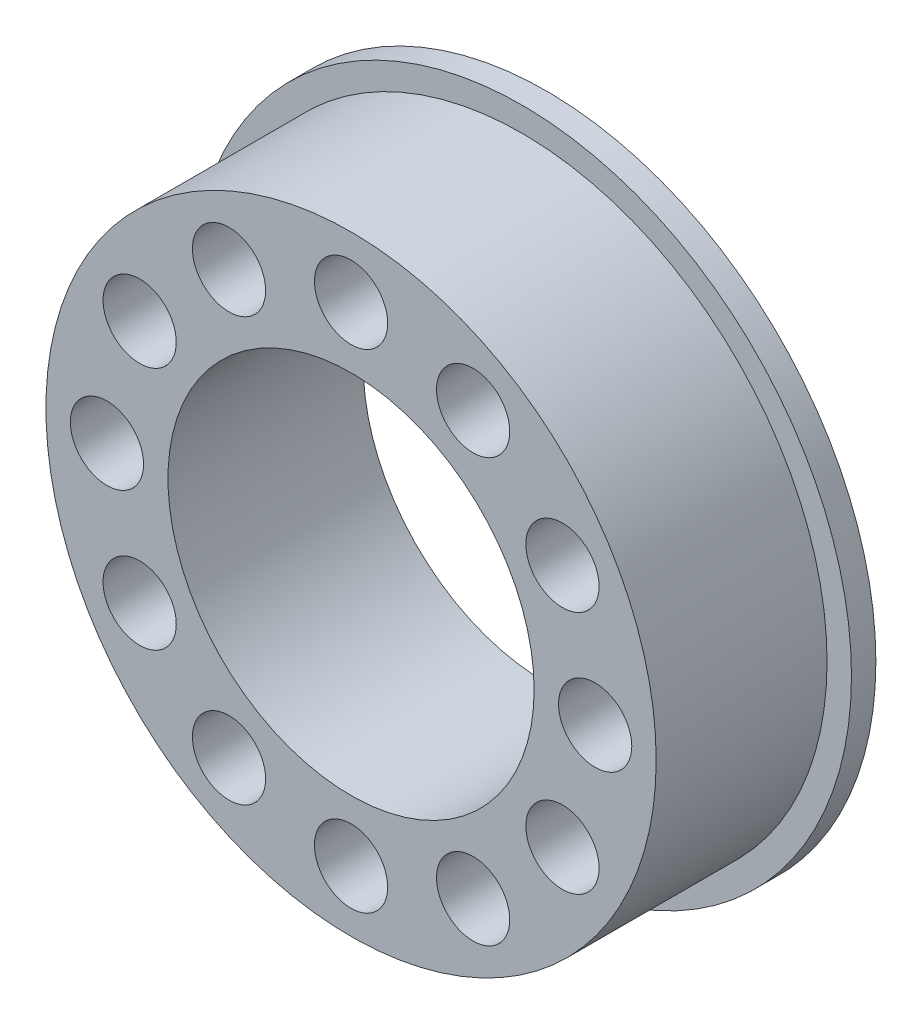
ISO-10303-21;
HEADER;
FILE_DESCRIPTION(('STEP AP214'),'2;1');
FILE_NAME('part.step','',(''),(''),'','','');
FILE_SCHEMA(('AUTOMOTIVE_DESIGN { 1 0 10303 214 1 1 1 1 }'));
ENDSEC;
DATA;
#1=APPLICATION_CONTEXT('core data for automotive mechanical design processes');
#2=APPLICATION_PROTOCOL_DEFINITION('international standard','automotive_design',2000,#1);
#3=PRODUCT_CONTEXT('',#1,'mechanical');
#4=PRODUCT('Part','Part','',(#3));
#5=PRODUCT_RELATED_PRODUCT_CATEGORY('part','',(#4));
#6=PRODUCT_DEFINITION_FORMATION('','',#4);
#7=PRODUCT_DEFINITION_CONTEXT('part definition',#1,'design');
#8=PRODUCT_DEFINITION('design','',#6,#7);
#9=PRODUCT_DEFINITION_SHAPE('','',#8);
#10=(LENGTH_UNIT() NAMED_UNIT(*) SI_UNIT(.MILLI.,.METRE.));
#11=(NAMED_UNIT(*) PLANE_ANGLE_UNIT() SI_UNIT($,.RADIAN.));
#12=(NAMED_UNIT(*) SI_UNIT($,.STERADIAN.) SOLID_ANGLE_UNIT());
#13=UNCERTAINTY_MEASURE_WITH_UNIT(LENGTH_MEASURE(1.E-05),#10,'distance_accuracy_value','');
#14=(GEOMETRIC_REPRESENTATION_CONTEXT(3) GLOBAL_UNCERTAINTY_ASSIGNED_CONTEXT((#13)) GLOBAL_UNIT_ASSIGNED_CONTEXT((#10,
#11,#12)) REPRESENTATION_CONTEXT('',''));
#15=CARTESIAN_POINT('',(0.,0.,0.));
#16=DIRECTION('',(0.,0.,1.));
#17=DIRECTION('',(1.,0.,0.));
#18=AXIS2_PLACEMENT_3D('',#15,#16,#17);
#19=CARTESIAN_POINT('',(0.,12.5,0.));
#20=DIRECTION('',(0.,0.,-1.));
#21=DIRECTION('',(-1.,0.,0.));
#22=AXIS2_PLACEMENT_3D('',#19,#20,#21);
#23=PLANE('',#22);
#24=CARTESIAN_POINT('',(5.00000000000001,8.66025403784438,0.));
#25=DIRECTION('',(0.,0.,1.));
#26=DIRECTION('',(1.,0.,0.));
#27=AXIS2_PLACEMENT_3D('',#24,#25,#26);
#28=CIRCLE('',#27,1.5);
#29=CARTESIAN_POINT('',(6.50000000000001,8.66025403784438,0.));
#30=VERTEX_POINT('',#29);
#31=EDGE_CURVE('E130',#30,#30,#28,.T.);
#32=ORIENTED_EDGE('',*,*,#31,.F.);
#33=EDGE_LOOP('',(#32));
#34=FACE_BOUND('',#33,.T.);
#35=CARTESIAN_POINT('',(8.66025403784439,5.,0.));
#36=DIRECTION('',(0.,0.,1.));
#37=DIRECTION('',(1.,0.,0.));
#38=AXIS2_PLACEMENT_3D('',#35,#36,#37);
#39=CIRCLE('',#38,1.50000000000031);
#40=CARTESIAN_POINT('',(10.1602540378447,5.,0.));
#41=VERTEX_POINT('',#40);
#42=EDGE_CURVE('E124',#41,#41,#39,.T.);
#43=ORIENTED_EDGE('',*,*,#42,.F.);
#44=EDGE_LOOP('',(#43));
#45=FACE_BOUND('',#44,.T.);
#46=CARTESIAN_POINT('',(10.,0.,0.));
#47=DIRECTION('',(0.,0.,1.));
#48=DIRECTION('',(1.,0.,0.));
#49=AXIS2_PLACEMENT_3D('',#46,#47,#48);
#50=CIRCLE('',#49,1.50000000000053);
#51=CARTESIAN_POINT('',(11.5000000000005,0.,0.));
#52=VERTEX_POINT('',#51);
#53=EDGE_CURVE('E118',#52,#52,#50,.T.);
#54=ORIENTED_EDGE('',*,*,#53,.F.);
#55=EDGE_LOOP('',(#54));
#56=FACE_BOUND('',#55,.T.);
#57=CARTESIAN_POINT('',(8.66025403784439,-5.,0.));
#58=DIRECTION('',(0.,0.,1.));
#59=DIRECTION('',(1.,0.,0.));
#60=AXIS2_PLACEMENT_3D('',#57,#58,#59);
#61=CIRCLE('',#60,1.50000000000072);
#62=CARTESIAN_POINT('',(10.1602540378451,-5.,0.));
#63=VERTEX_POINT('',#62);
#64=EDGE_CURVE('E112',#63,#63,#61,.T.);
#65=ORIENTED_EDGE('',*,*,#64,.F.);
#66=EDGE_LOOP('',(#65));
#67=FACE_BOUND('',#66,.T.);
#68=CARTESIAN_POINT('',(5.,-8.66025403784439,0.));
#69=DIRECTION('',(0.,0.,1.));
#70=DIRECTION('',(1.,0.,0.));
#71=AXIS2_PLACEMENT_3D('',#68,#69,#70);
#72=CIRCLE('',#71,1.50000000000082);
#73=CARTESIAN_POINT('',(6.50000000000082,-8.66025403784439,0.));
#74=VERTEX_POINT('',#73);
#75=EDGE_CURVE('E106',#74,#74,#72,.T.);
#76=ORIENTED_EDGE('',*,*,#75,.F.);
#77=EDGE_LOOP('',(#76));
#78=FACE_BOUND('',#77,.T.);
#79=CARTESIAN_POINT('',(0.,-10.,0.));
#80=DIRECTION('',(0.,0.,1.));
#81=DIRECTION('',(1.,0.,0.));
#82=AXIS2_PLACEMENT_3D('',#79,#80,#81);
#83=CIRCLE('',#82,1.50000000000081);
#84=CARTESIAN_POINT('',(1.50000000000081,-10.,0.));
#85=VERTEX_POINT('',#84);
#86=EDGE_CURVE('E100',#85,#85,#83,.T.);
#87=ORIENTED_EDGE('',*,*,#86,.F.);
#88=EDGE_LOOP('',(#87));
#89=FACE_BOUND('',#88,.T.);
#90=CARTESIAN_POINT('',(-5.,-8.66025403784439,0.));
#91=DIRECTION('',(0.,0.,1.));
#92=DIRECTION('',(1.,0.,0.));
#93=AXIS2_PLACEMENT_3D('',#90,#91,#92);
#94=CIRCLE('',#93,1.5000000000007);
#95=CARTESIAN_POINT('',(-3.4999999999993,-8.66025403784439,0.));
#96=VERTEX_POINT('',#95);
#97=EDGE_CURVE('E94',#96,#96,#94,.T.);
#98=ORIENTED_EDGE('',*,*,#97,.F.);
#99=EDGE_LOOP('',(#98));
#100=FACE_BOUND('',#99,.T.);
#101=CARTESIAN_POINT('',(-8.66025403784439,-5.,0.));
#102=DIRECTION('',(0.,0.,1.));
#103=DIRECTION('',(1.,0.,0.));
#104=AXIS2_PLACEMENT_3D('',#101,#102,#103);
#105=CIRCLE('',#104,1.5000000000005);
#106=CARTESIAN_POINT('',(-7.16025403784388,-5.,0.));
#107=VERTEX_POINT('',#106);
#108=EDGE_CURVE('E88',#107,#107,#105,.T.);
#109=ORIENTED_EDGE('',*,*,#108,.F.);
#110=EDGE_LOOP('',(#109));
#111=FACE_BOUND('',#110,.T.);
#112=CARTESIAN_POINT('',(-10.,0.,0.));
#113=DIRECTION('',(0.,0.,1.));
#114=DIRECTION('',(1.,0.,0.));
#115=AXIS2_PLACEMENT_3D('',#112,#113,#114);
#116=CIRCLE('',#115,1.50000000000028);
#117=CARTESIAN_POINT('',(-8.49999999999972,0.,0.));
#118=VERTEX_POINT('',#117);
#119=EDGE_CURVE('E82',#118,#118,#116,.T.);
#120=ORIENTED_EDGE('',*,*,#119,.F.);
#121=EDGE_LOOP('',(#120));
#122=FACE_BOUND('',#121,.T.);
#123=CARTESIAN_POINT('',(-8.66025403784439,4.99999999999999,0.));
#124=DIRECTION('',(0.,0.,1.));
#125=DIRECTION('',(1.,0.,0.));
#126=AXIS2_PLACEMENT_3D('',#123,#124,#125);
#127=CIRCLE('',#126,1.5000000000001);
#128=CARTESIAN_POINT('',(-7.16025403784429,4.99999999999999,0.));
#129=VERTEX_POINT('',#128);
#130=EDGE_CURVE('E76',#129,#129,#127,.T.);
#131=ORIENTED_EDGE('',*,*,#130,.F.);
#132=EDGE_LOOP('',(#131));
#133=FACE_BOUND('',#132,.T.);
#134=CARTESIAN_POINT('',(-4.99999999999995,8.66025403784417,0.));
#135=DIRECTION('',(0.,0.,1.));
#136=DIRECTION('',(1.,0.,0.));
#137=AXIS2_PLACEMENT_3D('',#134,#135,#136);
#138=CIRCLE('',#137,1.5);
#139=CARTESIAN_POINT('',(-3.49999999999995,8.66025403784417,0.));
#140=VERTEX_POINT('',#139);
#141=EDGE_CURVE('E70',#140,#140,#138,.T.);
#142=ORIENTED_EDGE('',*,*,#141,.F.);
#143=EDGE_LOOP('',(#142));
#144=FACE_BOUND('',#143,.T.);
#145=CARTESIAN_POINT('',(0.,10.,0.));
#146=DIRECTION('',(0.,0.,1.));
#147=DIRECTION('',(1.,0.,0.));
#148=AXIS2_PLACEMENT_3D('',#145,#146,#147);
#149=CIRCLE('',#148,1.5);
#150=CARTESIAN_POINT('',(1.5,10.,0.));
#151=VERTEX_POINT('',#150);
#152=EDGE_CURVE('E64',#151,#151,#149,.T.);
#153=ORIENTED_EDGE('',*,*,#152,.F.);
#154=EDGE_LOOP('',(#153));
#155=FACE_BOUND('',#154,.T.);
#156=CARTESIAN_POINT('',(0.,0.,0.));
#157=DIRECTION('',(0.,0.,1.));
#158=DIRECTION('',(1.,0.,0.));
#159=AXIS2_PLACEMENT_3D('',#156,#157,#158);
#160=CIRCLE('',#159,7.5);
#161=CARTESIAN_POINT('',(7.5,0.,0.));
#162=VERTEX_POINT('',#161);
#163=EDGE_CURVE('E10',#162,#162,#160,.T.);
#164=ORIENTED_EDGE('',*,*,#163,.F.);
#165=EDGE_LOOP('',(#164));
#166=FACE_BOUND('',#165,.T.);
#167=CARTESIAN_POINT('',(0.,0.,0.));
#168=DIRECTION('',(0.,0.,1.));
#169=DIRECTION('',(1.,0.,0.));
#170=AXIS2_PLACEMENT_3D('',#167,#168,#169);
#171=CIRCLE('',#170,12.5);
#172=CARTESIAN_POINT('',(12.5,0.,0.));
#173=VERTEX_POINT('',#172);
#174=EDGE_CURVE('E60',#173,#173,#171,.T.);
#175=ORIENTED_EDGE('',*,*,#174,.T.);
#176=EDGE_LOOP('',(#175));
#177=FACE_BOUND('',#176,.T.);
#178=ADVANCED_FACE('F38',(#34,#45,#56,#67,#78,#89,#100,#111,#122,#133,#144,#155,#166,#177),#23,.F.);
#179=CARTESIAN_POINT('',(0.,0.,0.));
#180=DIRECTION('',(0.,0.,1.));
#181=DIRECTION('',(1.,0.,0.));
#182=AXIS2_PLACEMENT_3D('',#179,#180,#181);
#183=CYLINDRICAL_SURFACE('',#182,7.5);
#184=CARTESIAN_POINT('',(0.,0.,-8.));
#185=DIRECTION('',(0.,0.,1.));
#186=DIRECTION('',(1.,0.,0.));
#187=AXIS2_PLACEMENT_3D('',#184,#185,#186);
#188=CIRCLE('',#187,7.5);
#189=CARTESIAN_POINT('',(7.5,0.,-8.));
#190=VERTEX_POINT('',#189);
#191=EDGE_CURVE('E44',#190,#190,#188,.T.);
#192=ORIENTED_EDGE('',*,*,#191,.F.);
#193=EDGE_LOOP('',(#192));
#194=FACE_BOUND('',#193,.T.);
#195=ORIENTED_EDGE('',*,*,#163,.T.);
#196=EDGE_LOOP('',(#195));
#197=FACE_BOUND('',#196,.T.);
#198=ADVANCED_FACE('F148',(#194,#197),#183,.F.);
#199=CARTESIAN_POINT('',(0.,7.5,-8.));
#200=DIRECTION('',(0.,0.,1.));
#201=DIRECTION('',(1.,0.,0.));
#202=AXIS2_PLACEMENT_3D('',#199,#200,#201);
#203=PLANE('',#202);
#204=CARTESIAN_POINT('',(5.00000000000001,8.66025403784438,-8.));
#205=DIRECTION('',(0.,0.,1.));
#206=DIRECTION('',(1.,0.,0.));
#207=AXIS2_PLACEMENT_3D('',#204,#205,#206);
#208=CIRCLE('',#207,1.5);
#209=CARTESIAN_POINT('',(6.50000000000001,8.66025403784438,-8.));
#210=VERTEX_POINT('',#209);
#211=EDGE_CURVE('E67',#210,#210,#208,.T.);
#212=ORIENTED_EDGE('',*,*,#211,.T.);
#213=EDGE_LOOP('',(#212));
#214=FACE_BOUND('',#213,.T.);
#215=CARTESIAN_POINT('',(8.66025403784439,5.,-8.));
#216=DIRECTION('',(0.,0.,1.));
#217=DIRECTION('',(1.,0.,0.));
#218=AXIS2_PLACEMENT_3D('',#215,#216,#217);
#219=CIRCLE('',#218,1.50000000000031);
#220=CARTESIAN_POINT('',(10.1602540378447,5.,-8.));
#221=VERTEX_POINT('',#220);
#222=EDGE_CURVE('E127',#221,#221,#219,.T.);
#223=ORIENTED_EDGE('',*,*,#222,.T.);
#224=EDGE_LOOP('',(#223));
#225=FACE_BOUND('',#224,.T.);
#226=CARTESIAN_POINT('',(10.,0.,-8.));
#227=DIRECTION('',(0.,0.,1.));
#228=DIRECTION('',(1.,0.,0.));
#229=AXIS2_PLACEMENT_3D('',#226,#227,#228);
#230=CIRCLE('',#229,1.50000000000053);
#231=CARTESIAN_POINT('',(11.5000000000005,0.,-8.));
#232=VERTEX_POINT('',#231);
#233=EDGE_CURVE('E121',#232,#232,#230,.T.);
#234=ORIENTED_EDGE('',*,*,#233,.T.);
#235=EDGE_LOOP('',(#234));
#236=FACE_BOUND('',#235,.T.);
#237=CARTESIAN_POINT('',(8.66025403784439,-5.,-8.));
#238=DIRECTION('',(0.,0.,1.));
#239=DIRECTION('',(1.,0.,0.));
#240=AXIS2_PLACEMENT_3D('',#237,#238,#239);
#241=CIRCLE('',#240,1.50000000000072);
#242=CARTESIAN_POINT('',(10.1602540378451,-5.,-8.));
#243=VERTEX_POINT('',#242);
#244=EDGE_CURVE('E115',#243,#243,#241,.T.);
#245=ORIENTED_EDGE('',*,*,#244,.T.);
#246=EDGE_LOOP('',(#245));
#247=FACE_BOUND('',#246,.T.);
#248=CARTESIAN_POINT('',(5.,-8.66025403784439,-8.));
#249=DIRECTION('',(0.,0.,1.));
#250=DIRECTION('',(1.,0.,0.));
#251=AXIS2_PLACEMENT_3D('',#248,#249,#250);
#252=CIRCLE('',#251,1.50000000000082);
#253=CARTESIAN_POINT('',(6.50000000000082,-8.66025403784439,-8.));
#254=VERTEX_POINT('',#253);
#255=EDGE_CURVE('E109',#254,#254,#252,.T.);
#256=ORIENTED_EDGE('',*,*,#255,.T.);
#257=EDGE_LOOP('',(#256));
#258=FACE_BOUND('',#257,.T.);
#259=CARTESIAN_POINT('',(0.,-10.,-8.));
#260=DIRECTION('',(0.,0.,1.));
#261=DIRECTION('',(1.,0.,0.));
#262=AXIS2_PLACEMENT_3D('',#259,#260,#261);
#263=CIRCLE('',#262,1.50000000000081);
#264=CARTESIAN_POINT('',(1.50000000000081,-10.,-8.));
#265=VERTEX_POINT('',#264);
#266=EDGE_CURVE('E103',#265,#265,#263,.T.);
#267=ORIENTED_EDGE('',*,*,#266,.T.);
#268=EDGE_LOOP('',(#267));
#269=FACE_BOUND('',#268,.T.);
#270=CARTESIAN_POINT('',(-5.,-8.66025403784439,-8.));
#271=DIRECTION('',(0.,0.,1.));
#272=DIRECTION('',(1.,0.,0.));
#273=AXIS2_PLACEMENT_3D('',#270,#271,#272);
#274=CIRCLE('',#273,1.5000000000007);
#275=CARTESIAN_POINT('',(-3.4999999999993,-8.66025403784439,-8.));
#276=VERTEX_POINT('',#275);
#277=EDGE_CURVE('E97',#276,#276,#274,.T.);
#278=ORIENTED_EDGE('',*,*,#277,.T.);
#279=EDGE_LOOP('',(#278));
#280=FACE_BOUND('',#279,.T.);
#281=CARTESIAN_POINT('',(-8.66025403784439,-5.,-8.));
#282=DIRECTION('',(0.,0.,1.));
#283=DIRECTION('',(1.,0.,0.));
#284=AXIS2_PLACEMENT_3D('',#281,#282,#283);
#285=CIRCLE('',#284,1.5000000000005);
#286=CARTESIAN_POINT('',(-7.16025403784388,-5.,-8.));
#287=VERTEX_POINT('',#286);
#288=EDGE_CURVE('E91',#287,#287,#285,.T.);
#289=ORIENTED_EDGE('',*,*,#288,.T.);
#290=EDGE_LOOP('',(#289));
#291=FACE_BOUND('',#290,.T.);
#292=CARTESIAN_POINT('',(-10.,0.,-8.));
#293=DIRECTION('',(0.,0.,1.));
#294=DIRECTION('',(1.,0.,0.));
#295=AXIS2_PLACEMENT_3D('',#292,#293,#294);
#296=CIRCLE('',#295,1.50000000000028);
#297=CARTESIAN_POINT('',(-8.49999999999972,0.,-8.));
#298=VERTEX_POINT('',#297);
#299=EDGE_CURVE('E85',#298,#298,#296,.T.);
#300=ORIENTED_EDGE('',*,*,#299,.T.);
#301=EDGE_LOOP('',(#300));
#302=FACE_BOUND('',#301,.T.);
#303=CARTESIAN_POINT('',(-8.66025403784439,4.99999999999999,-8.));
#304=DIRECTION('',(0.,0.,1.));
#305=DIRECTION('',(1.,0.,0.));
#306=AXIS2_PLACEMENT_3D('',#303,#304,#305);
#307=CIRCLE('',#306,1.5000000000001);
#308=CARTESIAN_POINT('',(-7.16025403784429,4.99999999999999,-8.));
#309=VERTEX_POINT('',#308);
#310=EDGE_CURVE('E79',#309,#309,#307,.T.);
#311=ORIENTED_EDGE('',*,*,#310,.T.);
#312=EDGE_LOOP('',(#311));
#313=FACE_BOUND('',#312,.T.);
#314=CARTESIAN_POINT('',(-4.99999999999995,8.66025403784417,-8.));
#315=DIRECTION('',(0.,0.,1.));
#316=DIRECTION('',(1.,0.,0.));
#317=AXIS2_PLACEMENT_3D('',#314,#315,#316);
#318=CIRCLE('',#317,1.5);
#319=CARTESIAN_POINT('',(-3.49999999999995,8.66025403784417,-8.));
#320=VERTEX_POINT('',#319);
#321=EDGE_CURVE('E73',#320,#320,#318,.T.);
#322=ORIENTED_EDGE('',*,*,#321,.T.);
#323=EDGE_LOOP('',(#322));
#324=FACE_BOUND('',#323,.T.);
#325=CARTESIAN_POINT('',(0.,10.,-8.));
#326=DIRECTION('',(0.,0.,1.));
#327=DIRECTION('',(1.,0.,0.));
#328=AXIS2_PLACEMENT_3D('',#325,#326,#327);
#329=CIRCLE('',#328,1.5);
#330=CARTESIAN_POINT('',(1.5,10.,-8.));
#331=VERTEX_POINT('',#330);
#332=EDGE_CURVE('E63',#331,#331,#329,.T.);
#333=ORIENTED_EDGE('',*,*,#332,.T.);
#334=EDGE_LOOP('',(#333));
#335=FACE_BOUND('',#334,.T.);
#336=CARTESIAN_POINT('',(0.,0.,-8.));
#337=DIRECTION('',(0.,0.,1.));
#338=DIRECTION('',(1.,0.,0.));
#339=AXIS2_PLACEMENT_3D('',#336,#337,#338);
#340=CIRCLE('',#339,13.5);
#341=CARTESIAN_POINT('',(13.5,0.,-8.));
#342=VERTEX_POINT('',#341);
#343=EDGE_CURVE('E48',#342,#342,#340,.T.);
#344=ORIENTED_EDGE('',*,*,#343,.F.);
#345=EDGE_LOOP('',(#344));
#346=FACE_BOUND('',#345,.T.);
#347=ORIENTED_EDGE('',*,*,#191,.T.);
#348=EDGE_LOOP('',(#347));
#349=FACE_BOUND('',#348,.T.);
#350=ADVANCED_FACE('F136',(#214,#225,#236,#247,#258,#269,#280,#291,#302,#313,#324,#335,#346,
#349),#203,.F.);
#351=CARTESIAN_POINT('',(0.,0.,0.));
#352=DIRECTION('',(0.,0.,1.));
#353=DIRECTION('',(1.,0.,0.));
#354=AXIS2_PLACEMENT_3D('',#351,#352,#353);
#355=CYLINDRICAL_SURFACE('',#354,13.5);
#356=CARTESIAN_POINT('',(0.,0.,-7.));
#357=DIRECTION('',(0.,0.,1.));
#358=DIRECTION('',(1.,0.,0.));
#359=AXIS2_PLACEMENT_3D('',#356,#357,#358);
#360=CIRCLE('',#359,13.5);
#361=CARTESIAN_POINT('',(13.5,0.,-7.));
#362=VERTEX_POINT('',#361);
#363=EDGE_CURVE('E52',#362,#362,#360,.T.);
#364=ORIENTED_EDGE('',*,*,#363,.F.);
#365=EDGE_LOOP('',(#364));
#366=FACE_BOUND('',#365,.T.);
#367=ORIENTED_EDGE('',*,*,#343,.T.);
#368=EDGE_LOOP('',(#367));
#369=FACE_BOUND('',#368,.T.);
#370=ADVANCED_FACE('F184',(#366,#369),#355,.T.);
#371=CARTESIAN_POINT('',(0.,13.5,-7.));
#372=DIRECTION('',(0.,0.,-1.));
#373=DIRECTION('',(-1.,0.,0.));
#374=AXIS2_PLACEMENT_3D('',#371,#372,#373);
#375=PLANE('',#374);
#376=CARTESIAN_POINT('',(0.,0.,-7.));
#377=DIRECTION('',(0.,0.,1.));
#378=DIRECTION('',(1.,0.,0.));
#379=AXIS2_PLACEMENT_3D('',#376,#377,#378);
#380=CIRCLE('',#379,12.5);
#381=CARTESIAN_POINT('',(12.5,0.,-7.));
#382=VERTEX_POINT('',#381);
#383=EDGE_CURVE('E57',#382,#382,#380,.T.);
#384=ORIENTED_EDGE('',*,*,#383,.F.);
#385=EDGE_LOOP('',(#384));
#386=FACE_BOUND('',#385,.T.);
#387=ORIENTED_EDGE('',*,*,#363,.T.);
#388=EDGE_LOOP('',(#387));
#389=FACE_BOUND('',#388,.T.);
#390=ADVANCED_FACE('F178',(#386,#389),#375,.F.);
#391=CARTESIAN_POINT('',(0.,0.,0.));
#392=DIRECTION('',(0.,0.,1.));
#393=DIRECTION('',(1.,0.,0.));
#394=AXIS2_PLACEMENT_3D('',#391,#392,#393);
#395=CYLINDRICAL_SURFACE('',#394,12.5);
#396=ORIENTED_EDGE('',*,*,#174,.F.);
#397=EDGE_LOOP('',(#396));
#398=FACE_BOUND('',#397,.T.);
#399=ORIENTED_EDGE('',*,*,#383,.T.);
#400=EDGE_LOOP('',(#399));
#401=FACE_BOUND('',#400,.T.);
#402=ADVANCED_FACE('F174',(#398,#401),#395,.T.);
#403=CARTESIAN_POINT('',(0.,10.,-8.));
#404=DIRECTION('',(0.,0.,1.));
#405=DIRECTION('',(1.,0.,0.));
#406=AXIS2_PLACEMENT_3D('',#403,#404,#405);
#407=CYLINDRICAL_SURFACE('',#406,1.5);
#408=ORIENTED_EDGE('',*,*,#332,.F.);
#409=EDGE_LOOP('',(#408));
#410=FACE_BOUND('',#409,.T.);
#411=ORIENTED_EDGE('',*,*,#152,.T.);
#412=EDGE_LOOP('',(#411));
#413=FACE_BOUND('',#412,.T.);
#414=ADVANCED_FACE('F177',(#410,#413),#407,.F.);
#415=CARTESIAN_POINT('',(-4.99999999999995,8.66025403784417,-8.));
#416=DIRECTION('',(0.,0.,1.));
#417=DIRECTION('',(1.,0.,0.));
#418=AXIS2_PLACEMENT_3D('',#415,#416,#417);
#419=CYLINDRICAL_SURFACE('',#418,1.5);
#420=ORIENTED_EDGE('',*,*,#321,.F.);
#421=EDGE_LOOP('',(#420));
#422=FACE_BOUND('',#421,.T.);
#423=ORIENTED_EDGE('',*,*,#141,.T.);
#424=EDGE_LOOP('',(#423));
#425=FACE_BOUND('',#424,.T.);
#426=ADVANCED_FACE('F203',(#422,#425),#419,.F.);
#427=CARTESIAN_POINT('',(-8.66025403784439,4.99999999999999,-8.));
#428=DIRECTION('',(0.,0.,1.));
#429=DIRECTION('',(1.,0.,0.));
#430=AXIS2_PLACEMENT_3D('',#427,#428,#429);
#431=CYLINDRICAL_SURFACE('',#430,1.5000000000001);
#432=ORIENTED_EDGE('',*,*,#310,.F.);
#433=EDGE_LOOP('',(#432));
#434=FACE_BOUND('',#433,.T.);
#435=ORIENTED_EDGE('',*,*,#130,.T.);
#436=EDGE_LOOP('',(#435));
#437=FACE_BOUND('',#436,.T.);
#438=ADVANCED_FACE('F207',(#434,#437),#431,.F.);
#439=CARTESIAN_POINT('',(-10.,0.,-8.));
#440=DIRECTION('',(0.,0.,1.));
#441=DIRECTION('',(1.,0.,0.));
#442=AXIS2_PLACEMENT_3D('',#439,#440,#441);
#443=CYLINDRICAL_SURFACE('',#442,1.50000000000028);
#444=ORIENTED_EDGE('',*,*,#299,.F.);
#445=EDGE_LOOP('',(#444));
#446=FACE_BOUND('',#445,.T.);
#447=ORIENTED_EDGE('',*,*,#119,.T.);
#448=EDGE_LOOP('',(#447));
#449=FACE_BOUND('',#448,.T.);
#450=ADVANCED_FACE('F211',(#446,#449),#443,.F.);
#451=CARTESIAN_POINT('',(-8.66025403784439,-5.,-8.));
#452=DIRECTION('',(0.,0.,1.));
#453=DIRECTION('',(1.,0.,0.));
#454=AXIS2_PLACEMENT_3D('',#451,#452,#453);
#455=CYLINDRICAL_SURFACE('',#454,1.5000000000005);
#456=ORIENTED_EDGE('',*,*,#288,.F.);
#457=EDGE_LOOP('',(#456));
#458=FACE_BOUND('',#457,.T.);
#459=ORIENTED_EDGE('',*,*,#108,.T.);
#460=EDGE_LOOP('',(#459));
#461=FACE_BOUND('',#460,.T.);
#462=ADVANCED_FACE('F215',(#458,#461),#455,.F.);
#463=CARTESIAN_POINT('',(-5.,-8.66025403784439,-8.));
#464=DIRECTION('',(0.,0.,1.));
#465=DIRECTION('',(1.,0.,0.));
#466=AXIS2_PLACEMENT_3D('',#463,#464,#465);
#467=CYLINDRICAL_SURFACE('',#466,1.5000000000007);
#468=ORIENTED_EDGE('',*,*,#277,.F.);
#469=EDGE_LOOP('',(#468));
#470=FACE_BOUND('',#469,.T.);
#471=ORIENTED_EDGE('',*,*,#97,.T.);
#472=EDGE_LOOP('',(#471));
#473=FACE_BOUND('',#472,.T.);
#474=ADVANCED_FACE('F219',(#470,#473),#467,.F.);
#475=CARTESIAN_POINT('',(0.,-10.,-8.));
#476=DIRECTION('',(0.,0.,1.));
#477=DIRECTION('',(1.,0.,0.));
#478=AXIS2_PLACEMENT_3D('',#475,#476,#477);
#479=CYLINDRICAL_SURFACE('',#478,1.50000000000081);
#480=ORIENTED_EDGE('',*,*,#266,.F.);
#481=EDGE_LOOP('',(#480));
#482=FACE_BOUND('',#481,.T.);
#483=ORIENTED_EDGE('',*,*,#86,.T.);
#484=EDGE_LOOP('',(#483));
#485=FACE_BOUND('',#484,.T.);
#486=ADVANCED_FACE('F223',(#482,#485),#479,.F.);
#487=CARTESIAN_POINT('',(5.,-8.66025403784439,-8.));
#488=DIRECTION('',(0.,0.,1.));
#489=DIRECTION('',(1.,0.,0.));
#490=AXIS2_PLACEMENT_3D('',#487,#488,#489);
#491=CYLINDRICAL_SURFACE('',#490,1.50000000000082);
#492=ORIENTED_EDGE('',*,*,#255,.F.);
#493=EDGE_LOOP('',(#492));
#494=FACE_BOUND('',#493,.T.);
#495=ORIENTED_EDGE('',*,*,#75,.T.);
#496=EDGE_LOOP('',(#495));
#497=FACE_BOUND('',#496,.T.);
#498=ADVANCED_FACE('F227',(#494,#497),#491,.F.);
#499=CARTESIAN_POINT('',(8.66025403784439,-5.,-8.));
#500=DIRECTION('',(0.,0.,1.));
#501=DIRECTION('',(1.,0.,0.));
#502=AXIS2_PLACEMENT_3D('',#499,#500,#501);
#503=CYLINDRICAL_SURFACE('',#502,1.50000000000072);
#504=ORIENTED_EDGE('',*,*,#244,.F.);
#505=EDGE_LOOP('',(#504));
#506=FACE_BOUND('',#505,.T.);
#507=ORIENTED_EDGE('',*,*,#64,.T.);
#508=EDGE_LOOP('',(#507));
#509=FACE_BOUND('',#508,.T.);
#510=ADVANCED_FACE('F231',(#506,#509),#503,.F.);
#511=CARTESIAN_POINT('',(10.,0.,-8.));
#512=DIRECTION('',(0.,0.,1.));
#513=DIRECTION('',(1.,0.,0.));
#514=AXIS2_PLACEMENT_3D('',#511,#512,#513);
#515=CYLINDRICAL_SURFACE('',#514,1.50000000000053);
#516=ORIENTED_EDGE('',*,*,#233,.F.);
#517=EDGE_LOOP('',(#516));
#518=FACE_BOUND('',#517,.T.);
#519=ORIENTED_EDGE('',*,*,#53,.T.);
#520=EDGE_LOOP('',(#519));
#521=FACE_BOUND('',#520,.T.);
#522=ADVANCED_FACE('F235',(#518,#521),#515,.F.);
#523=CARTESIAN_POINT('',(8.66025403784439,5.,-8.));
#524=DIRECTION('',(0.,0.,1.));
#525=DIRECTION('',(1.,0.,0.));
#526=AXIS2_PLACEMENT_3D('',#523,#524,#525);
#527=CYLINDRICAL_SURFACE('',#526,1.50000000000031);
#528=ORIENTED_EDGE('',*,*,#222,.F.);
#529=EDGE_LOOP('',(#528));
#530=FACE_BOUND('',#529,.T.);
#531=ORIENTED_EDGE('',*,*,#42,.T.);
#532=EDGE_LOOP('',(#531));
#533=FACE_BOUND('',#532,.T.);
#534=ADVANCED_FACE('F142',(#530,#533),#527,.F.);
#535=CARTESIAN_POINT('',(5.00000000000001,8.66025403784438,-8.));
#536=DIRECTION('',(0.,0.,1.));
#537=DIRECTION('',(1.,0.,0.));
#538=AXIS2_PLACEMENT_3D('',#535,#536,#537);
#539=CYLINDRICAL_SURFACE('',#538,1.5);
#540=ORIENTED_EDGE('',*,*,#211,.F.);
#541=EDGE_LOOP('',(#540));
#542=FACE_BOUND('',#541,.T.);
#543=ORIENTED_EDGE('',*,*,#31,.T.);
#544=EDGE_LOOP('',(#543));
#545=FACE_BOUND('',#544,.T.);
#546=ADVANCED_FACE('F139',(#542,#545),#539,.F.);
#547=CLOSED_SHELL('',(#178,#198,#350,#370,#390,#402,#414,#426,#438,#450,#462,#474,#486,#498,
#510,#522,#534,#546));
#548=MANIFOLD_SOLID_BREP('B2',#547);
#549=ADVANCED_BREP_SHAPE_REPRESENTATION('',(#18,#548),#14);
#550=SHAPE_DEFINITION_REPRESENTATION(#9,#549);
ENDSEC;
END-ISO-10303-21;
